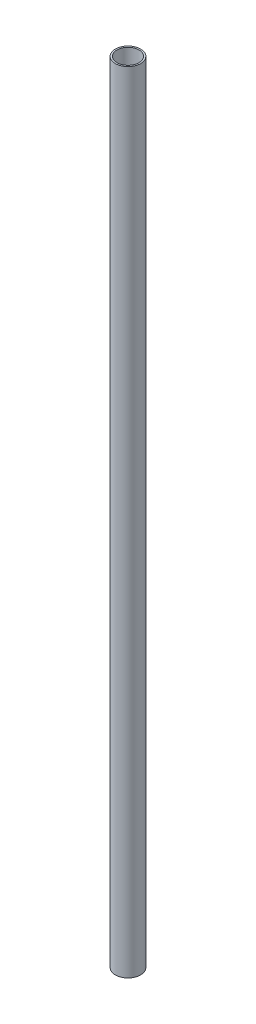
ISO-10303-21;
HEADER;
FILE_DESCRIPTION(('STEP AP214'),'2;1');
FILE_NAME('part.step','',(''),(''),'','','');
FILE_SCHEMA(('AUTOMOTIVE_DESIGN { 1 0 10303 214 1 1 1 1 }'));
ENDSEC;
DATA;
#1=APPLICATION_CONTEXT('core data for automotive mechanical design processes');
#2=APPLICATION_PROTOCOL_DEFINITION('international standard','automotive_design',2000,#1);
#3=PRODUCT_CONTEXT('',#1,'mechanical');
#4=PRODUCT('Part','Part','',(#3));
#5=PRODUCT_RELATED_PRODUCT_CATEGORY('part','',(#4));
#6=PRODUCT_DEFINITION_FORMATION('','',#4);
#7=PRODUCT_DEFINITION_CONTEXT('part definition',#1,'design');
#8=PRODUCT_DEFINITION('design','',#6,#7);
#9=PRODUCT_DEFINITION_SHAPE('','',#8);
#10=(LENGTH_UNIT() NAMED_UNIT(*) SI_UNIT(.MILLI.,.METRE.));
#11=(NAMED_UNIT(*) PLANE_ANGLE_UNIT() SI_UNIT($,.RADIAN.));
#12=(NAMED_UNIT(*) SI_UNIT($,.STERADIAN.) SOLID_ANGLE_UNIT());
#13=UNCERTAINTY_MEASURE_WITH_UNIT(LENGTH_MEASURE(1.E-05),#10,'distance_accuracy_value','');
#14=(GEOMETRIC_REPRESENTATION_CONTEXT(3) GLOBAL_UNCERTAINTY_ASSIGNED_CONTEXT((#13)) GLOBAL_UNIT_ASSIGNED_CONTEXT((#10,
#11,#12)) REPRESENTATION_CONTEXT('',''));
#15=CARTESIAN_POINT('',(0.,0.,0.));
#16=DIRECTION('',(0.,0.,1.));
#17=DIRECTION('',(1.,0.,0.));
#18=AXIS2_PLACEMENT_3D('',#15,#16,#17);
#19=CARTESIAN_POINT('',(0.,250.,0.));
#20=DIRECTION('',(0.,1.,0.));
#21=DIRECTION('',(0.,0.,1.));
#22=AXIS2_PLACEMENT_3D('',#19,#20,#21);
#23=PLANE('',#22);
#24=CARTESIAN_POINT('',(0.,250.,0.));
#25=DIRECTION('',(0.,1.,0.));
#26=DIRECTION('',(0.,0.,1.));
#27=AXIS2_PLACEMENT_3D('',#24,#25,#26);
#28=CIRCLE('',#27,8.);
#29=CARTESIAN_POINT('',(0.,250.,8.));
#30=VERTEX_POINT('',#29);
#31=EDGE_CURVE('E10',#30,#30,#28,.T.);
#32=ORIENTED_EDGE('',*,*,#31,.T.);
#33=EDGE_LOOP('',(#32));
#34=FACE_BOUND('',#33,.T.);
#35=CARTESIAN_POINT('',(0.,250.,0.));
#36=DIRECTION('',(0.,1.,0.));
#37=DIRECTION('',(0.,0.,1.));
#38=AXIS2_PLACEMENT_3D('',#35,#36,#37);
#39=CIRCLE('',#38,7.);
#40=CARTESIAN_POINT('',(0.,250.,7.));
#41=VERTEX_POINT('',#40);
#42=EDGE_CURVE('E48',#41,#41,#39,.T.);
#43=ORIENTED_EDGE('',*,*,#42,.F.);
#44=EDGE_LOOP('',(#43));
#45=FACE_BOUND('',#44,.T.);
#46=ADVANCED_FACE('F37',(#34,#45),#23,.T.);
#47=CARTESIAN_POINT('',(0.,-250.,0.));
#48=DIRECTION('',(0.,1.,0.));
#49=DIRECTION('',(0.,0.,1.));
#50=AXIS2_PLACEMENT_3D('',#47,#48,#49);
#51=PLANE('',#50);
#52=CARTESIAN_POINT('',(0.,-250.,0.));
#53=DIRECTION('',(0.,1.,0.));
#54=DIRECTION('',(0.,0.,1.));
#55=AXIS2_PLACEMENT_3D('',#52,#53,#54);
#56=CIRCLE('',#55,8.);
#57=CARTESIAN_POINT('',(0.,-250.,8.));
#58=VERTEX_POINT('',#57);
#59=EDGE_CURVE('E41',#58,#58,#56,.T.);
#60=ORIENTED_EDGE('',*,*,#59,.F.);
#61=EDGE_LOOP('',(#60));
#62=FACE_BOUND('',#61,.T.);
#63=CARTESIAN_POINT('',(0.,-250.,0.));
#64=DIRECTION('',(0.,1.,0.));
#65=DIRECTION('',(0.,0.,1.));
#66=AXIS2_PLACEMENT_3D('',#63,#64,#65);
#67=CIRCLE('',#66,7.);
#68=CARTESIAN_POINT('',(0.,-250.,7.));
#69=VERTEX_POINT('',#68);
#70=EDGE_CURVE('E50',#69,#69,#67,.T.);
#71=ORIENTED_EDGE('',*,*,#70,.T.);
#72=EDGE_LOOP('',(#71));
#73=FACE_BOUND('',#72,.T.);
#74=ADVANCED_FACE('F60',(#62,#73),#51,.F.);
#75=CARTESIAN_POINT('',(0.,250.,0.));
#76=DIRECTION('',(0.,-1.,0.));
#77=DIRECTION('',(0.,0.,-1.));
#78=AXIS2_PLACEMENT_3D('',#75,#76,#77);
#79=CYLINDRICAL_SURFACE('',#78,8.);
#80=ORIENTED_EDGE('',*,*,#31,.F.);
#81=EDGE_LOOP('',(#80));
#82=FACE_BOUND('',#81,.T.);
#83=ORIENTED_EDGE('',*,*,#59,.T.);
#84=EDGE_LOOP('',(#83));
#85=FACE_BOUND('',#84,.T.);
#86=ADVANCED_FACE('F39',(#82,#85),#79,.T.);
#87=CARTESIAN_POINT('',(0.,250.,0.));
#88=DIRECTION('',(0.,-1.,0.));
#89=DIRECTION('',(0.,0.,-1.));
#90=AXIS2_PLACEMENT_3D('',#87,#88,#89);
#91=CYLINDRICAL_SURFACE('',#90,7.);
#92=ORIENTED_EDGE('',*,*,#42,.T.);
#93=EDGE_LOOP('',(#92));
#94=FACE_BOUND('',#93,.T.);
#95=ORIENTED_EDGE('',*,*,#70,.F.);
#96=EDGE_LOOP('',(#95));
#97=FACE_BOUND('',#96,.T.);
#98=ADVANCED_FACE('F56',(#94,#97),#91,.F.);
#99=CLOSED_SHELL('',(#46,#74,#86,#98));
#100=MANIFOLD_SOLID_BREP('B2',#99);
#101=ADVANCED_BREP_SHAPE_REPRESENTATION('',(#18,#100),#14);
#102=SHAPE_DEFINITION_REPRESENTATION(#9,#101);
ENDSEC;
END-ISO-10303-21;
